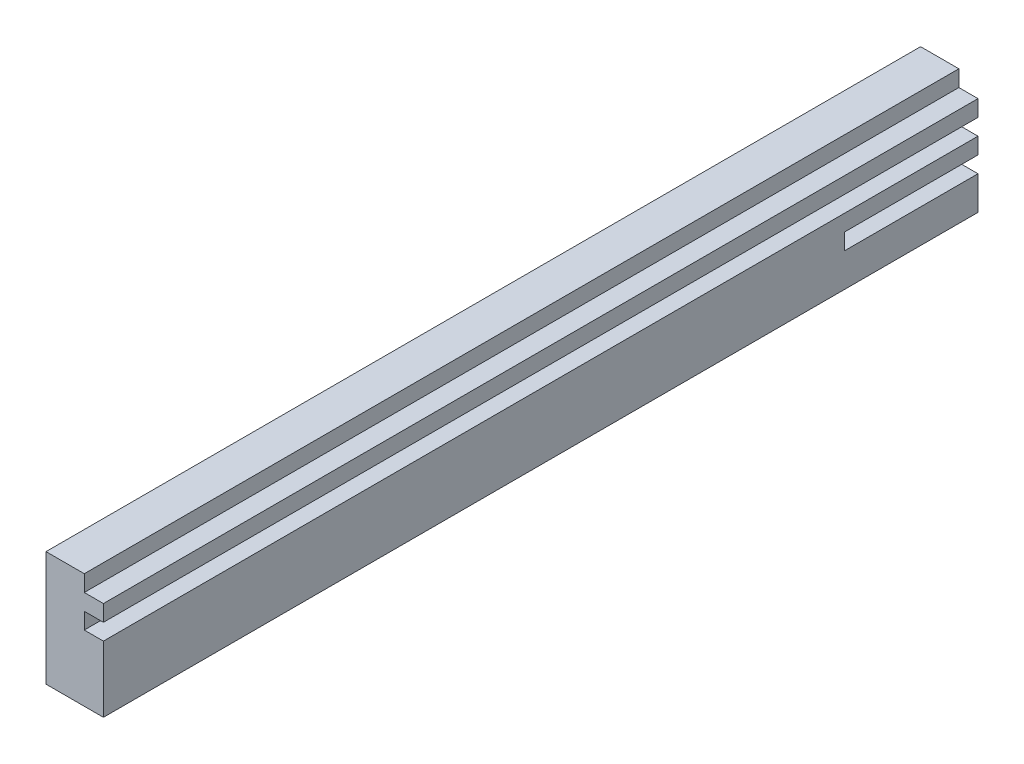
ISO-10303-21;
HEADER;
FILE_DESCRIPTION(('STEP AP214'),'2;1');
FILE_NAME('part.step','',(''),(''),'','','');
FILE_SCHEMA(('AUTOMOTIVE_DESIGN { 1 0 10303 214 1 1 1 1 }'));
ENDSEC;
DATA;
#1=APPLICATION_CONTEXT('core data for automotive mechanical design processes');
#2=APPLICATION_PROTOCOL_DEFINITION('international standard','automotive_design',2000,#1);
#3=PRODUCT_CONTEXT('',#1,'mechanical');
#4=PRODUCT('Part','Part','',(#3));
#5=PRODUCT_RELATED_PRODUCT_CATEGORY('part','',(#4));
#6=PRODUCT_DEFINITION_FORMATION('','',#4);
#7=PRODUCT_DEFINITION_CONTEXT('part definition',#1,'design');
#8=PRODUCT_DEFINITION('design','',#6,#7);
#9=PRODUCT_DEFINITION_SHAPE('','',#8);
#10=(LENGTH_UNIT() NAMED_UNIT(*) SI_UNIT(.MILLI.,.METRE.));
#11=(NAMED_UNIT(*) PLANE_ANGLE_UNIT() SI_UNIT($,.RADIAN.));
#12=(NAMED_UNIT(*) SI_UNIT($,.STERADIAN.) SOLID_ANGLE_UNIT());
#13=UNCERTAINTY_MEASURE_WITH_UNIT(LENGTH_MEASURE(1.E-05),#10,'distance_accuracy_value','');
#14=(GEOMETRIC_REPRESENTATION_CONTEXT(3) GLOBAL_UNCERTAINTY_ASSIGNED_CONTEXT((#13)) GLOBAL_UNIT_ASSIGNED_CONTEXT((#10,
#11,#12)) REPRESENTATION_CONTEXT('',''));
#15=CARTESIAN_POINT('',(0.,0.,0.));
#16=DIRECTION('',(0.,0.,1.));
#17=DIRECTION('',(1.,0.,0.));
#18=AXIS2_PLACEMENT_3D('',#15,#16,#17);
#19=CARTESIAN_POINT('',(30.,0.,-457.));
#20=DIRECTION('',(0.,0.,1.));
#21=DIRECTION('',(1.,0.,0.));
#22=AXIS2_PLACEMENT_3D('',#19,#20,#21);
#23=PLANE('',#22);
#24=DIRECTION('',(0.,-1.,0.));
#25=VECTOR('',#24,1.);
#26=CARTESIAN_POINT('',(20.,60.,-457.));
#27=LINE('',#26,#25);
#28=CARTESIAN_POINT('',(20.,60.,-457.));
#29=VERTEX_POINT('',#28);
#30=CARTESIAN_POINT('',(20.,51.5,-457.));
#31=VERTEX_POINT('',#30);
#32=EDGE_CURVE('E151',#29,#31,#27,.T.);
#33=ORIENTED_EDGE('',*,*,#32,.T.);
#34=DIRECTION('',(1.,0.,0.));
#35=VECTOR('',#34,1.);
#36=CARTESIAN_POINT('',(20.,51.5,-457.));
#37=LINE('',#36,#35);
#38=CARTESIAN_POINT('',(30.,51.5,-457.));
#39=VERTEX_POINT('',#38);
#40=EDGE_CURVE('E135',#31,#39,#37,.T.);
#41=ORIENTED_EDGE('',*,*,#40,.T.);
#42=DIRECTION('',(0.,1.,0.));
#43=VECTOR('',#42,1.);
#44=CARTESIAN_POINT('',(30.,0.,-457.));
#45=LINE('',#44,#43);
#46=CARTESIAN_POINT('',(30.,43.,-457.));
#47=VERTEX_POINT('',#46);
#48=EDGE_CURVE('E224',#47,#39,#45,.T.);
#49=ORIENTED_EDGE('',*,*,#48,.F.);
#50=DIRECTION('',(1.,0.,0.));
#51=VECTOR('',#50,1.);
#52=CARTESIAN_POINT('',(20.,43.,-457.));
#53=LINE('',#52,#51);
#54=CARTESIAN_POINT('',(20.,43.,-457.));
#55=VERTEX_POINT('',#54);
#56=EDGE_CURVE('E48',#55,#47,#53,.T.);
#57=ORIENTED_EDGE('',*,*,#56,.F.);
#58=DIRECTION('',(0.,-1.,0.));
#59=VECTOR('',#58,1.);
#60=CARTESIAN_POINT('',(20.,43.,-457.));
#61=LINE('',#60,#59);
#62=CARTESIAN_POINT('',(20.,34.5,-457.));
#63=VERTEX_POINT('',#62);
#64=EDGE_CURVE('E187',#55,#63,#61,.T.);
#65=ORIENTED_EDGE('',*,*,#64,.T.);
#66=DIRECTION('',(1.,0.,0.));
#67=VECTOR('',#66,1.);
#68=CARTESIAN_POINT('',(20.,34.5,-457.));
#69=LINE('',#68,#67);
#70=CARTESIAN_POINT('',(30.,34.5,-457.));
#71=VERTEX_POINT('',#70);
#72=EDGE_CURVE('E168',#63,#71,#69,.T.);
#73=ORIENTED_EDGE('',*,*,#72,.T.);
#74=CARTESIAN_POINT('',(30.,26.,-457.));
#75=VERTEX_POINT('',#74);
#76=EDGE_CURVE('E229',#75,#71,#45,.T.);
#77=ORIENTED_EDGE('',*,*,#76,.F.);
#78=DIRECTION('',(1.,0.,0.));
#79=VECTOR('',#78,1.);
#80=CARTESIAN_POINT('',(20.,26.,-457.));
#81=LINE('',#80,#79);
#82=CARTESIAN_POINT('',(20.,26.,-457.));
#83=VERTEX_POINT('',#82);
#84=EDGE_CURVE('E56',#83,#75,#81,.T.);
#85=ORIENTED_EDGE('',*,*,#84,.F.);
#86=DIRECTION('',(0.,-1.,0.));
#87=VECTOR('',#86,1.);
#88=CARTESIAN_POINT('',(20.,26.,-457.));
#89=LINE('',#88,#87);
#90=CARTESIAN_POINT('',(20.,17.5,-457.));
#91=VERTEX_POINT('',#90);
#92=EDGE_CURVE('E200',#83,#91,#89,.T.);
#93=ORIENTED_EDGE('',*,*,#92,.T.);
#94=DIRECTION('',(1.,0.,0.));
#95=VECTOR('',#94,1.);
#96=CARTESIAN_POINT('',(20.,17.5,-457.));
#97=LINE('',#96,#95);
#98=CARTESIAN_POINT('',(30.,17.5,-457.));
#99=VERTEX_POINT('',#98);
#100=EDGE_CURVE('E197',#91,#99,#97,.T.);
#101=ORIENTED_EDGE('',*,*,#100,.T.);
#102=CARTESIAN_POINT('',(30.,0.,-457.));
#103=VERTEX_POINT('',#102);
#104=EDGE_CURVE('E225',#103,#99,#45,.T.);
#105=ORIENTED_EDGE('',*,*,#104,.F.);
#106=DIRECTION('',(-1.,0.,0.));
#107=VECTOR('',#106,1.);
#108=CARTESIAN_POINT('',(30.,0.,-457.));
#109=LINE('',#108,#107);
#110=CARTESIAN_POINT('',(0.,0.,-457.));
#111=VERTEX_POINT('',#110);
#112=EDGE_CURVE('E41',#103,#111,#109,.T.);
#113=ORIENTED_EDGE('',*,*,#112,.T.);
#114=DIRECTION('',(0.,1.,0.));
#115=VECTOR('',#114,1.);
#116=CARTESIAN_POINT('',(0.,0.,-457.));
#117=LINE('',#116,#115);
#118=CARTESIAN_POINT('',(0.,60.,-457.));
#119=VERTEX_POINT('',#118);
#120=EDGE_CURVE('E234',#111,#119,#117,.T.);
#121=ORIENTED_EDGE('',*,*,#120,.T.);
#122=DIRECTION('',(-1.,0.,0.));
#123=VECTOR('',#122,1.);
#124=CARTESIAN_POINT('',(30.,60.,-457.));
#125=LINE('',#124,#123);
#126=EDGE_CURVE('E158',#29,#119,#125,.T.);
#127=ORIENTED_EDGE('',*,*,#126,.F.);
#128=EDGE_LOOP('',(#33,#41,#49,#57,#65,#73,#77,#85,#93,#101,#105,#113,#121,#127));
#129=FACE_BOUND('',#128,.T.);
#130=ADVANCED_FACE('F33',(#129),#23,.F.);
#131=CARTESIAN_POINT('',(30.,0.,0.));
#132=DIRECTION('',(-1.,0.,0.));
#133=DIRECTION('',(0.,0.,1.));
#134=AXIS2_PLACEMENT_3D('',#131,#132,#133);
#135=PLANE('',#134);
#136=ORIENTED_EDGE('',*,*,#48,.T.);
#137=DIRECTION('',(0.,0.,-1.));
#138=VECTOR('',#137,1.);
#139=CARTESIAN_POINT('',(30.,51.5,0.));
#140=LINE('',#139,#138);
#141=CARTESIAN_POINT('',(30.,51.5,0.));
#142=VERTEX_POINT('',#141);
#143=EDGE_CURVE('E141',#142,#39,#140,.T.);
#144=ORIENTED_EDGE('',*,*,#143,.F.);
#145=DIRECTION('',(0.,-1.,0.));
#146=VECTOR('',#145,1.);
#147=CARTESIAN_POINT('',(30.,0.,0.));
#148=LINE('',#147,#146);
#149=CARTESIAN_POINT('',(30.,43.,0.));
#150=VERTEX_POINT('',#149);
#151=EDGE_CURVE('E220',#142,#150,#148,.T.);
#152=ORIENTED_EDGE('',*,*,#151,.T.);
#153=DIRECTION('',(0.,0.,-1.));
#154=VECTOR('',#153,1.);
#155=CARTESIAN_POINT('',(30.,43.,0.));
#156=LINE('',#155,#154);
#157=EDGE_CURVE('E179',#150,#47,#156,.T.);
#158=ORIENTED_EDGE('',*,*,#157,.T.);
#159=EDGE_LOOP('',(#136,#144,#152,#158));
#160=FACE_BOUND('',#159,.T.);
#161=ADVANCED_FACE('F256',(#160),#135,.F.);
#162=ORIENTED_EDGE('',*,*,#76,.T.);
#163=DIRECTION('',(0.,0.,-1.));
#164=VECTOR('',#163,1.);
#165=CARTESIAN_POINT('',(30.,34.5,0.));
#166=LINE('',#165,#164);
#167=CARTESIAN_POINT('',(30.,34.5,0.));
#168=VERTEX_POINT('',#167);
#169=EDGE_CURVE('E165',#168,#71,#166,.T.);
#170=ORIENTED_EDGE('',*,*,#169,.F.);
#171=CARTESIAN_POINT('',(30.,0.,0.));
#172=VERTEX_POINT('',#171);
#173=EDGE_CURVE('E218',#168,#172,#148,.T.);
#174=ORIENTED_EDGE('',*,*,#173,.T.);
#175=DIRECTION('',(0.,0.,-1.));
#176=VECTOR('',#175,1.);
#177=CARTESIAN_POINT('',(30.,0.,0.));
#178=LINE('',#177,#176);
#179=EDGE_CURVE('E222',#172,#103,#178,.T.);
#180=ORIENTED_EDGE('',*,*,#179,.T.);
#181=ORIENTED_EDGE('',*,*,#104,.T.);
#182=DIRECTION('',(0.,0.,1.));
#183=VECTOR('',#182,1.);
#184=CARTESIAN_POINT('',(30.,17.5,-457.));
#185=LINE('',#184,#183);
#186=CARTESIAN_POINT('',(30.,17.5,-387.111548622784));
#187=VERTEX_POINT('',#186);
#188=EDGE_CURVE('E178',#99,#187,#185,.T.);
#189=ORIENTED_EDGE('',*,*,#188,.T.);
#190=DIRECTION('',(0.,-1.,0.));
#191=VECTOR('',#190,1.);
#192=CARTESIAN_POINT('',(30.,26.,-387.111548622784));
#193=LINE('',#192,#191);
#194=CARTESIAN_POINT('',(30.,26.,-387.111548622784));
#195=VERTEX_POINT('',#194);
#196=EDGE_CURVE('E203',#195,#187,#193,.T.);
#197=ORIENTED_EDGE('',*,*,#196,.F.);
#198=DIRECTION('',(0.,0.,1.));
#199=VECTOR('',#198,1.);
#200=CARTESIAN_POINT('',(30.,26.,-457.));
#201=LINE('',#200,#199);
#202=EDGE_CURVE('E201',#75,#195,#201,.T.);
#203=ORIENTED_EDGE('',*,*,#202,.F.);
#204=EDGE_LOOP('',(#162,#170,#174,#180,#181,#189,#197,#203));
#205=FACE_BOUND('',#204,.T.);
#206=ADVANCED_FACE('F261',(#205),#135,.F.);
#207=CARTESIAN_POINT('',(30.,0.,0.));
#208=DIRECTION('',(0.,0.,-1.));
#209=DIRECTION('',(0.,1.,0.));
#210=AXIS2_PLACEMENT_3D('',#207,#208,#209);
#211=PLANE('',#210);
#212=ORIENTED_EDGE('',*,*,#151,.F.);
#213=DIRECTION('',(1.,0.,0.));
#214=VECTOR('',#213,1.);
#215=CARTESIAN_POINT('',(20.,51.5,0.));
#216=LINE('',#215,#214);
#217=CARTESIAN_POINT('',(20.,51.5,0.));
#218=VERTEX_POINT('',#217);
#219=EDGE_CURVE('E146',#218,#142,#216,.T.);
#220=ORIENTED_EDGE('',*,*,#219,.F.);
#221=DIRECTION('',(0.,-1.,0.));
#222=VECTOR('',#221,1.);
#223=CARTESIAN_POINT('',(20.,60.,0.));
#224=LINE('',#223,#222);
#225=CARTESIAN_POINT('',(20.,60.,0.));
#226=VERTEX_POINT('',#225);
#227=EDGE_CURVE('E147',#226,#218,#224,.T.);
#228=ORIENTED_EDGE('',*,*,#227,.F.);
#229=DIRECTION('',(-1.,0.,0.));
#230=VECTOR('',#229,1.);
#231=CARTESIAN_POINT('',(30.,60.,0.));
#232=LINE('',#231,#230);
#233=CARTESIAN_POINT('',(0.,60.,0.));
#234=VERTEX_POINT('',#233);
#235=EDGE_CURVE('E228',#226,#234,#232,.T.);
#236=ORIENTED_EDGE('',*,*,#235,.T.);
#237=DIRECTION('',(0.,-1.,0.));
#238=VECTOR('',#237,1.);
#239=CARTESIAN_POINT('',(0.,0.,0.));
#240=LINE('',#239,#238);
#241=CARTESIAN_POINT('',(0.,0.,0.));
#242=VERTEX_POINT('',#241);
#243=EDGE_CURVE('E166',#234,#242,#240,.T.);
#244=ORIENTED_EDGE('',*,*,#243,.T.);
#245=DIRECTION('',(-1.,0.,0.));
#246=VECTOR('',#245,1.);
#247=CARTESIAN_POINT('',(30.,0.,0.));
#248=LINE('',#247,#246);
#249=EDGE_CURVE('E11',#172,#242,#248,.T.);
#250=ORIENTED_EDGE('',*,*,#249,.F.);
#251=ORIENTED_EDGE('',*,*,#173,.F.);
#252=DIRECTION('',(1.,0.,0.));
#253=VECTOR('',#252,1.);
#254=CARTESIAN_POINT('',(20.,34.5,0.));
#255=LINE('',#254,#253);
#256=CARTESIAN_POINT('',(20.,34.5,0.));
#257=VERTEX_POINT('',#256);
#258=EDGE_CURVE('E176',#257,#168,#255,.T.);
#259=ORIENTED_EDGE('',*,*,#258,.F.);
#260=DIRECTION('',(0.,-1.,0.));
#261=VECTOR('',#260,1.);
#262=CARTESIAN_POINT('',(20.,43.,0.));
#263=LINE('',#262,#261);
#264=CARTESIAN_POINT('',(20.,43.,0.));
#265=VERTEX_POINT('',#264);
#266=EDGE_CURVE('E171',#265,#257,#263,.T.);
#267=ORIENTED_EDGE('',*,*,#266,.F.);
#268=DIRECTION('',(1.,0.,0.));
#269=VECTOR('',#268,1.);
#270=CARTESIAN_POINT('',(20.,43.,0.));
#271=LINE('',#270,#269);
#272=EDGE_CURVE('E173',#265,#150,#271,.T.);
#273=ORIENTED_EDGE('',*,*,#272,.T.);
#274=EDGE_LOOP('',(#212,#220,#228,#236,#244,#250,#251,#259,#267,#273));
#275=FACE_BOUND('',#274,.T.);
#276=ADVANCED_FACE('F35',(#275),#211,.F.);
#277=CARTESIAN_POINT('',(30.,0.,0.));
#278=DIRECTION('',(0.,1.,0.));
#279=DIRECTION('',(0.,0.,1.));
#280=AXIS2_PLACEMENT_3D('',#277,#278,#279);
#281=PLANE('',#280);
#282=DIRECTION('',(0.,0.,-1.));
#283=VECTOR('',#282,1.);
#284=CARTESIAN_POINT('',(0.,0.,0.));
#285=LINE('',#284,#283);
#286=EDGE_CURVE('E232',#242,#111,#285,.T.);
#287=ORIENTED_EDGE('',*,*,#286,.T.);
#288=ORIENTED_EDGE('',*,*,#112,.F.);
#289=ORIENTED_EDGE('',*,*,#179,.F.);
#290=ORIENTED_EDGE('',*,*,#249,.T.);
#291=EDGE_LOOP('',(#287,#288,#289,#290));
#292=FACE_BOUND('',#291,.T.);
#293=ADVANCED_FACE('F273',(#292),#281,.F.);
#294=CARTESIAN_POINT('',(30.,60.,0.));
#295=DIRECTION('',(0.,-1.,0.));
#296=DIRECTION('',(0.,0.,-1.));
#297=AXIS2_PLACEMENT_3D('',#294,#295,#296);
#298=PLANE('',#297);
#299=ORIENTED_EDGE('',*,*,#235,.F.);
#300=DIRECTION('',(0.,0.,-1.));
#301=VECTOR('',#300,1.);
#302=CARTESIAN_POINT('',(20.,60.,0.));
#303=LINE('',#302,#301);
#304=EDGE_CURVE('E159',#226,#29,#303,.T.);
#305=ORIENTED_EDGE('',*,*,#304,.T.);
#306=ORIENTED_EDGE('',*,*,#126,.T.);
#307=DIRECTION('',(0.,0.,1.));
#308=VECTOR('',#307,1.);
#309=CARTESIAN_POINT('',(0.,60.,0.));
#310=LINE('',#309,#308);
#311=EDGE_CURVE('E221',#119,#234,#310,.T.);
#312=ORIENTED_EDGE('',*,*,#311,.T.);
#313=EDGE_LOOP('',(#299,#305,#306,#312));
#314=FACE_BOUND('',#313,.T.);
#315=ADVANCED_FACE('F251',(#314),#298,.F.);
#316=CARTESIAN_POINT('',(0.,0.,0.));
#317=DIRECTION('',(-1.,0.,0.));
#318=DIRECTION('',(0.,0.,1.));
#319=AXIS2_PLACEMENT_3D('',#316,#317,#318);
#320=PLANE('',#319);
#321=ORIENTED_EDGE('',*,*,#243,.F.);
#322=ORIENTED_EDGE('',*,*,#311,.F.);
#323=ORIENTED_EDGE('',*,*,#120,.F.);
#324=ORIENTED_EDGE('',*,*,#286,.F.);
#325=EDGE_LOOP('',(#321,#322,#323,#324));
#326=FACE_BOUND('',#325,.T.);
#327=ADVANCED_FACE('F248',(#326),#320,.T.);
#328=CARTESIAN_POINT('',(20.,17.5,-457.));
#329=DIRECTION('',(0.,1.,0.));
#330=DIRECTION('',(0.,0.,1.));
#331=AXIS2_PLACEMENT_3D('',#328,#329,#330);
#332=PLANE('',#331);
#333=ORIENTED_EDGE('',*,*,#188,.F.);
#334=ORIENTED_EDGE('',*,*,#100,.F.);
#335=DIRECTION('',(0.,0.,1.));
#336=VECTOR('',#335,1.);
#337=CARTESIAN_POINT('',(20.,17.5,-457.));
#338=LINE('',#337,#336);
#339=CARTESIAN_POINT('',(20.,17.5,-387.111548622784));
#340=VERTEX_POINT('',#339);
#341=EDGE_CURVE('E204',#91,#340,#338,.T.);
#342=ORIENTED_EDGE('',*,*,#341,.T.);
#343=DIRECTION('',(1.,0.,0.));
#344=VECTOR('',#343,1.);
#345=CARTESIAN_POINT('',(20.,17.5,-387.111548622784));
#346=LINE('',#345,#344);
#347=EDGE_CURVE('E192',#340,#187,#346,.T.);
#348=ORIENTED_EDGE('',*,*,#347,.T.);
#349=EDGE_LOOP('',(#333,#334,#342,#348));
#350=FACE_BOUND('',#349,.T.);
#351=ADVANCED_FACE('F288',(#350),#332,.T.);
#352=CARTESIAN_POINT('',(20.,26.,-387.111548622784));
#353=DIRECTION('',(0.,0.,1.));
#354=DIRECTION('',(1.,0.,0.));
#355=AXIS2_PLACEMENT_3D('',#352,#353,#354);
#356=PLANE('',#355);
#357=ORIENTED_EDGE('',*,*,#196,.T.);
#358=ORIENTED_EDGE('',*,*,#347,.F.);
#359=DIRECTION('',(0.,-1.,0.));
#360=VECTOR('',#359,1.);
#361=CARTESIAN_POINT('',(20.,26.,-387.111548622784));
#362=LINE('',#361,#360);
#363=CARTESIAN_POINT('',(20.,26.,-387.111548622784));
#364=VERTEX_POINT('',#363);
#365=EDGE_CURVE('E214',#364,#340,#362,.T.);
#366=ORIENTED_EDGE('',*,*,#365,.F.);
#367=DIRECTION('',(1.,0.,0.));
#368=VECTOR('',#367,1.);
#369=CARTESIAN_POINT('',(20.,26.,-387.111548622784));
#370=LINE('',#369,#368);
#371=EDGE_CURVE('E194',#364,#195,#370,.T.);
#372=ORIENTED_EDGE('',*,*,#371,.T.);
#373=EDGE_LOOP('',(#357,#358,#366,#372));
#374=FACE_BOUND('',#373,.T.);
#375=ADVANCED_FACE('F297',(#374),#356,.F.);
#376=CARTESIAN_POINT('',(20.,26.,-457.));
#377=DIRECTION('',(0.,1.,0.));
#378=DIRECTION('',(0.,0.,1.));
#379=AXIS2_PLACEMENT_3D('',#376,#377,#378);
#380=PLANE('',#379);
#381=ORIENTED_EDGE('',*,*,#202,.T.);
#382=ORIENTED_EDGE('',*,*,#371,.F.);
#383=DIRECTION('',(0.,0.,1.));
#384=VECTOR('',#383,1.);
#385=CARTESIAN_POINT('',(20.,26.,-457.));
#386=LINE('',#385,#384);
#387=EDGE_CURVE('E211',#83,#364,#386,.T.);
#388=ORIENTED_EDGE('',*,*,#387,.F.);
#389=ORIENTED_EDGE('',*,*,#84,.T.);
#390=EDGE_LOOP('',(#381,#382,#388,#389));
#391=FACE_BOUND('',#390,.T.);
#392=ADVANCED_FACE('F293',(#391),#380,.F.);
#393=CARTESIAN_POINT('',(20.,0.,0.));
#394=DIRECTION('',(1.,0.,0.));
#395=DIRECTION('',(0.,0.,-1.));
#396=AXIS2_PLACEMENT_3D('',#393,#394,#395);
#397=PLANE('',#396);
#398=ORIENTED_EDGE('',*,*,#341,.F.);
#399=ORIENTED_EDGE('',*,*,#92,.F.);
#400=ORIENTED_EDGE('',*,*,#387,.T.);
#401=ORIENTED_EDGE('',*,*,#365,.T.);
#402=EDGE_LOOP('',(#398,#399,#400,#401));
#403=FACE_BOUND('',#402,.T.);
#404=ADVANCED_FACE('F290',(#403),#397,.T.);
#405=CARTESIAN_POINT('',(20.,34.5,0.));
#406=DIRECTION('',(0.,-1.,0.));
#407=DIRECTION('',(0.,0.,-1.));
#408=AXIS2_PLACEMENT_3D('',#405,#406,#407);
#409=PLANE('',#408);
#410=ORIENTED_EDGE('',*,*,#169,.T.);
#411=ORIENTED_EDGE('',*,*,#72,.F.);
#412=DIRECTION('',(0.,0.,-1.));
#413=VECTOR('',#412,1.);
#414=CARTESIAN_POINT('',(20.,34.5,0.));
#415=LINE('',#414,#413);
#416=EDGE_CURVE('E181',#257,#63,#415,.T.);
#417=ORIENTED_EDGE('',*,*,#416,.F.);
#418=ORIENTED_EDGE('',*,*,#258,.T.);
#419=EDGE_LOOP('',(#410,#411,#417,#418));
#420=FACE_BOUND('',#419,.T.);
#421=ADVANCED_FACE('F266',(#420),#409,.F.);
#422=CARTESIAN_POINT('',(20.,43.,0.));
#423=DIRECTION('',(0.,-1.,0.));
#424=DIRECTION('',(0.,0.,-1.));
#425=AXIS2_PLACEMENT_3D('',#422,#423,#424);
#426=PLANE('',#425);
#427=ORIENTED_EDGE('',*,*,#157,.F.);
#428=ORIENTED_EDGE('',*,*,#272,.F.);
#429=DIRECTION('',(0.,0.,-1.));
#430=VECTOR('',#429,1.);
#431=CARTESIAN_POINT('',(20.,43.,0.));
#432=LINE('',#431,#430);
#433=EDGE_CURVE('E185',#265,#55,#432,.T.);
#434=ORIENTED_EDGE('',*,*,#433,.T.);
#435=ORIENTED_EDGE('',*,*,#56,.T.);
#436=EDGE_LOOP('',(#427,#428,#434,#435));
#437=FACE_BOUND('',#436,.T.);
#438=ADVANCED_FACE('F306',(#437),#426,.T.);
#439=CARTESIAN_POINT('',(20.,0.,0.));
#440=DIRECTION('',(-1.,0.,0.));
#441=DIRECTION('',(0.,0.,1.));
#442=AXIS2_PLACEMENT_3D('',#439,#440,#441);
#443=PLANE('',#442);
#444=ORIENTED_EDGE('',*,*,#416,.T.);
#445=ORIENTED_EDGE('',*,*,#64,.F.);
#446=ORIENTED_EDGE('',*,*,#433,.F.);
#447=ORIENTED_EDGE('',*,*,#266,.T.);
#448=EDGE_LOOP('',(#444,#445,#446,#447));
#449=FACE_BOUND('',#448,.T.);
#450=ADVANCED_FACE('F268',(#449),#443,.F.);
#451=CARTESIAN_POINT('',(20.,51.5,0.));
#452=DIRECTION('',(0.,-1.,0.));
#453=DIRECTION('',(0.,0.,-1.));
#454=AXIS2_PLACEMENT_3D('',#451,#452,#453);
#455=PLANE('',#454);
#456=ORIENTED_EDGE('',*,*,#143,.T.);
#457=ORIENTED_EDGE('',*,*,#40,.F.);
#458=DIRECTION('',(0.,0.,-1.));
#459=VECTOR('',#458,1.);
#460=CARTESIAN_POINT('',(20.,51.5,0.));
#461=LINE('',#460,#459);
#462=EDGE_CURVE('E138',#218,#31,#461,.T.);
#463=ORIENTED_EDGE('',*,*,#462,.F.);
#464=ORIENTED_EDGE('',*,*,#219,.T.);
#465=EDGE_LOOP('',(#456,#457,#463,#464));
#466=FACE_BOUND('',#465,.T.);
#467=ADVANCED_FACE('F137',(#466),#455,.F.);
#468=CARTESIAN_POINT('',(20.,0.,0.));
#469=DIRECTION('',(-1.,0.,0.));
#470=DIRECTION('',(0.,0.,1.));
#471=AXIS2_PLACEMENT_3D('',#468,#469,#470);
#472=PLANE('',#471);
#473=ORIENTED_EDGE('',*,*,#462,.T.);
#474=ORIENTED_EDGE('',*,*,#32,.F.);
#475=ORIENTED_EDGE('',*,*,#304,.F.);
#476=ORIENTED_EDGE('',*,*,#227,.T.);
#477=EDGE_LOOP('',(#473,#474,#475,#476));
#478=FACE_BOUND('',#477,.T.);
#479=ADVANCED_FACE('F150',(#478),#472,.F.);
#480=CLOSED_SHELL('',(#130,#161,#206,#276,#293,#315,#327,#351,#375,#392,#404,#421,#438,#450,
#467,#479));
#481=MANIFOLD_SOLID_BREP('B2',#480);
#482=ADVANCED_BREP_SHAPE_REPRESENTATION('',(#18,#481),#14);
#483=SHAPE_DEFINITION_REPRESENTATION(#9,#482);
ENDSEC;
END-ISO-10303-21;
